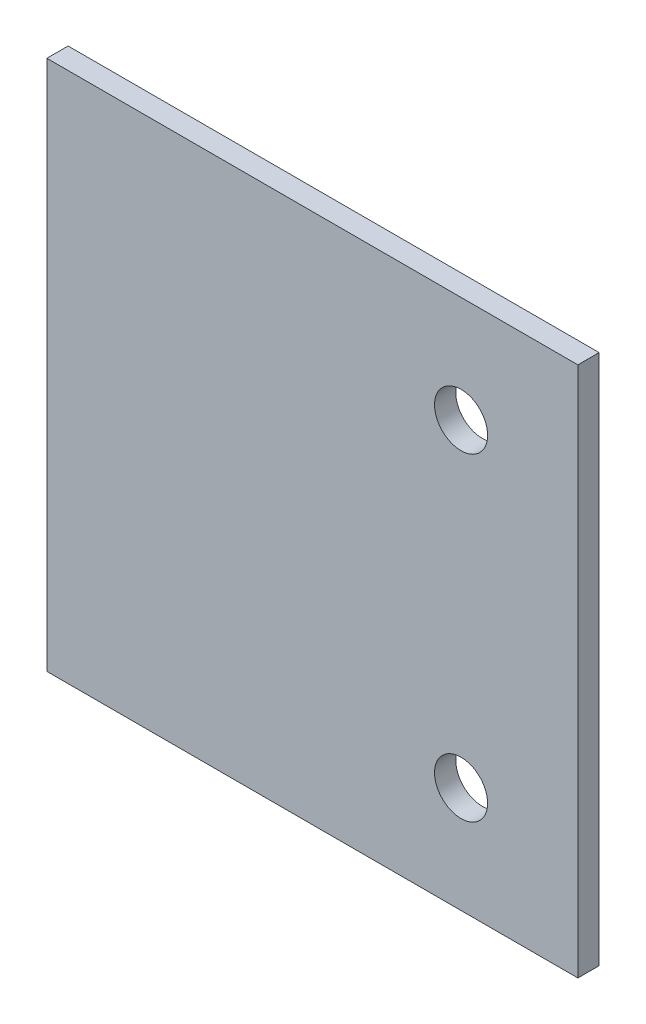
ISO-10303-21;
HEADER;
FILE_DESCRIPTION(('STEP AP214'),'2;1');
FILE_NAME('part.step','',(''),(''),'','','');
FILE_SCHEMA(('AUTOMOTIVE_DESIGN { 1 0 10303 214 1 1 1 1 }'));
ENDSEC;
DATA;
#1=APPLICATION_CONTEXT('core data for automotive mechanical design processes');
#2=APPLICATION_PROTOCOL_DEFINITION('international standard','automotive_design',2000,#1);
#3=PRODUCT_CONTEXT('',#1,'mechanical');
#4=PRODUCT('Part','Part','',(#3));
#5=PRODUCT_RELATED_PRODUCT_CATEGORY('part','',(#4));
#6=PRODUCT_DEFINITION_FORMATION('','',#4);
#7=PRODUCT_DEFINITION_CONTEXT('part definition',#1,'design');
#8=PRODUCT_DEFINITION('design','',#6,#7);
#9=PRODUCT_DEFINITION_SHAPE('','',#8);
#10=(LENGTH_UNIT() NAMED_UNIT(*) SI_UNIT(.MILLI.,.METRE.));
#11=(NAMED_UNIT(*) PLANE_ANGLE_UNIT() SI_UNIT($,.RADIAN.));
#12=(NAMED_UNIT(*) SI_UNIT($,.STERADIAN.) SOLID_ANGLE_UNIT());
#13=UNCERTAINTY_MEASURE_WITH_UNIT(LENGTH_MEASURE(1.E-05),#10,'distance_accuracy_value','');
#14=(GEOMETRIC_REPRESENTATION_CONTEXT(3) GLOBAL_UNCERTAINTY_ASSIGNED_CONTEXT((#13)) GLOBAL_UNIT_ASSIGNED_CONTEXT((#10,
#11,#12)) REPRESENTATION_CONTEXT('',''));
#15=CARTESIAN_POINT('',(0.,0.,0.));
#16=DIRECTION('',(0.,0.,1.));
#17=DIRECTION('',(1.,0.,0.));
#18=AXIS2_PLACEMENT_3D('',#15,#16,#17);
#19=CARTESIAN_POINT('',(25.,-25.,2.));
#20=DIRECTION('',(-1.,0.,0.));
#21=DIRECTION('',(0.,0.,1.));
#22=AXIS2_PLACEMENT_3D('',#19,#20,#21);
#23=PLANE('',#22);
#24=DIRECTION('',(0.,1.,0.));
#25=VECTOR('',#24,1.);
#26=CARTESIAN_POINT('',(25.,-25.,0.));
#27=LINE('',#26,#25);
#28=CARTESIAN_POINT('',(25.,-25.,0.));
#29=VERTEX_POINT('',#28);
#30=CARTESIAN_POINT('',(25.,25.,0.));
#31=VERTEX_POINT('',#30);
#32=EDGE_CURVE('E113',#29,#31,#27,.T.);
#33=ORIENTED_EDGE('',*,*,#32,.T.);
#34=DIRECTION('',(0.,0.,-1.));
#35=VECTOR('',#34,1.);
#36=CARTESIAN_POINT('',(25.,25.,2.));
#37=LINE('',#36,#35);
#38=CARTESIAN_POINT('',(25.,25.,2.));
#39=VERTEX_POINT('',#38);
#40=EDGE_CURVE('E11',#39,#31,#37,.T.);
#41=ORIENTED_EDGE('',*,*,#40,.F.);
#42=DIRECTION('',(0.,1.,0.));
#43=VECTOR('',#42,1.);
#44=CARTESIAN_POINT('',(25.,-25.,2.));
#45=LINE('',#44,#43);
#46=CARTESIAN_POINT('',(25.,-25.,2.));
#47=VERTEX_POINT('',#46);
#48=EDGE_CURVE('E97',#47,#39,#45,.T.);
#49=ORIENTED_EDGE('',*,*,#48,.F.);
#50=DIRECTION('',(0.,0.,-1.));
#51=VECTOR('',#50,1.);
#52=CARTESIAN_POINT('',(25.,-25.,2.));
#53=LINE('',#52,#51);
#54=EDGE_CURVE('E109',#47,#29,#53,.T.);
#55=ORIENTED_EDGE('',*,*,#54,.T.);
#56=EDGE_LOOP('',(#33,#41,#49,#55));
#57=FACE_BOUND('',#56,.T.);
#58=ADVANCED_FACE('F45',(#57),#23,.F.);
#59=CARTESIAN_POINT('',(-25.,25.,2.));
#60=DIRECTION('',(0.,-1.,0.));
#61=DIRECTION('',(0.,0.,-1.));
#62=AXIS2_PLACEMENT_3D('',#59,#60,#61);
#63=PLANE('',#62);
#64=DIRECTION('',(-1.,0.,0.));
#65=VECTOR('',#64,1.);
#66=CARTESIAN_POINT('',(-25.,25.,0.));
#67=LINE('',#66,#65);
#68=CARTESIAN_POINT('',(-25.,25.,0.));
#69=VERTEX_POINT('',#68);
#70=EDGE_CURVE('E102',#31,#69,#67,.T.);
#71=ORIENTED_EDGE('',*,*,#70,.T.);
#72=DIRECTION('',(0.,0.,-1.));
#73=VECTOR('',#72,1.);
#74=CARTESIAN_POINT('',(-25.,25.,2.));
#75=LINE('',#74,#73);
#76=CARTESIAN_POINT('',(-25.,25.,2.));
#77=VERTEX_POINT('',#76);
#78=EDGE_CURVE('E54',#77,#69,#75,.T.);
#79=ORIENTED_EDGE('',*,*,#78,.F.);
#80=DIRECTION('',(-1.,0.,0.));
#81=VECTOR('',#80,1.);
#82=CARTESIAN_POINT('',(-25.,25.,2.));
#83=LINE('',#82,#81);
#84=EDGE_CURVE('E92',#39,#77,#83,.T.);
#85=ORIENTED_EDGE('',*,*,#84,.F.);
#86=ORIENTED_EDGE('',*,*,#40,.T.);
#87=EDGE_LOOP('',(#71,#79,#85,#86));
#88=FACE_BOUND('',#87,.T.);
#89=ADVANCED_FACE('F101',(#88),#63,.F.);
#90=CARTESIAN_POINT('',(-25.,-25.,2.));
#91=DIRECTION('',(1.,0.,0.));
#92=DIRECTION('',(0.,0.,-1.));
#93=AXIS2_PLACEMENT_3D('',#90,#91,#92);
#94=PLANE('',#93);
#95=DIRECTION('',(0.,-1.,0.));
#96=VECTOR('',#95,1.);
#97=CARTESIAN_POINT('',(-25.,-25.,0.));
#98=LINE('',#97,#96);
#99=CARTESIAN_POINT('',(-25.,-25.,0.));
#100=VERTEX_POINT('',#99);
#101=EDGE_CURVE('E79',#69,#100,#98,.T.);
#102=ORIENTED_EDGE('',*,*,#101,.T.);
#103=DIRECTION('',(0.,0.,-1.));
#104=VECTOR('',#103,1.);
#105=CARTESIAN_POINT('',(-25.,-25.,2.));
#106=LINE('',#105,#104);
#107=CARTESIAN_POINT('',(-25.,-25.,2.));
#108=VERTEX_POINT('',#107);
#109=EDGE_CURVE('E104',#108,#100,#106,.T.);
#110=ORIENTED_EDGE('',*,*,#109,.F.);
#111=DIRECTION('',(0.,-1.,0.));
#112=VECTOR('',#111,1.);
#113=CARTESIAN_POINT('',(-25.,-25.,2.));
#114=LINE('',#113,#112);
#115=EDGE_CURVE('E95',#77,#108,#114,.T.);
#116=ORIENTED_EDGE('',*,*,#115,.F.);
#117=ORIENTED_EDGE('',*,*,#78,.T.);
#118=EDGE_LOOP('',(#102,#110,#116,#117));
#119=FACE_BOUND('',#118,.T.);
#120=ADVANCED_FACE('F105',(#119),#94,.F.);
#121=CARTESIAN_POINT('',(-25.,-25.,2.));
#122=DIRECTION('',(0.,1.,0.));
#123=DIRECTION('',(0.,0.,1.));
#124=AXIS2_PLACEMENT_3D('',#121,#122,#123);
#125=PLANE('',#124);
#126=DIRECTION('',(1.,0.,0.));
#127=VECTOR('',#126,1.);
#128=CARTESIAN_POINT('',(-25.,-25.,0.));
#129=LINE('',#128,#127);
#130=EDGE_CURVE('E85',#100,#29,#129,.T.);
#131=ORIENTED_EDGE('',*,*,#130,.T.);
#132=ORIENTED_EDGE('',*,*,#54,.F.);
#133=DIRECTION('',(1.,0.,0.));
#134=VECTOR('',#133,1.);
#135=CARTESIAN_POINT('',(-25.,-25.,2.));
#136=LINE('',#135,#134);
#137=EDGE_CURVE('E62',#108,#47,#136,.T.);
#138=ORIENTED_EDGE('',*,*,#137,.F.);
#139=ORIENTED_EDGE('',*,*,#109,.T.);
#140=EDGE_LOOP('',(#131,#132,#138,#139));
#141=FACE_BOUND('',#140,.T.);
#142=ADVANCED_FACE('F127',(#141),#125,.F.);
#143=CARTESIAN_POINT('',(0.,0.,2.));
#144=DIRECTION('',(0.,0.,-1.));
#145=DIRECTION('',(-1.,0.,0.));
#146=AXIS2_PLACEMENT_3D('',#143,#144,#145);
#147=PLANE('',#146);
#148=CARTESIAN_POINT('',(14.,-15.,2.));
#149=DIRECTION('',(0.,0.,1.));
#150=DIRECTION('',(1.,0.,0.));
#151=AXIS2_PLACEMENT_3D('',#148,#149,#150);
#152=CIRCLE('',#151,2.5);
#153=CARTESIAN_POINT('',(16.5,-15.,2.));
#154=VERTEX_POINT('',#153);
#155=EDGE_CURVE('E138',#154,#154,#152,.T.);
#156=ORIENTED_EDGE('',*,*,#155,.F.);
#157=EDGE_LOOP('',(#156));
#158=FACE_BOUND('',#157,.T.);
#159=CARTESIAN_POINT('',(14.,15.,2.));
#160=DIRECTION('',(0.,0.,1.));
#161=DIRECTION('',(1.,0.,0.));
#162=AXIS2_PLACEMENT_3D('',#159,#160,#161);
#163=CIRCLE('',#162,2.5);
#164=CARTESIAN_POINT('',(16.5,15.,2.));
#165=VERTEX_POINT('',#164);
#166=EDGE_CURVE('E134',#165,#165,#163,.T.);
#167=ORIENTED_EDGE('',*,*,#166,.F.);
#168=EDGE_LOOP('',(#167));
#169=FACE_BOUND('',#168,.T.);
#170=ORIENTED_EDGE('',*,*,#48,.T.);
#171=ORIENTED_EDGE('',*,*,#84,.T.);
#172=ORIENTED_EDGE('',*,*,#115,.T.);
#173=ORIENTED_EDGE('',*,*,#137,.T.);
#174=EDGE_LOOP('',(#170,#171,#172,#173));
#175=FACE_BOUND('',#174,.T.);
#176=ADVANCED_FACE('F93',(#158,#169,#175),#147,.F.);
#177=CARTESIAN_POINT('',(0.,0.,0.));
#178=DIRECTION('',(0.,0.,-1.));
#179=DIRECTION('',(-1.,0.,0.));
#180=AXIS2_PLACEMENT_3D('',#177,#178,#179);
#181=PLANE('',#180);
#182=CARTESIAN_POINT('',(14.,-15.,0.));
#183=DIRECTION('',(0.,0.,-1.));
#184=DIRECTION('',(-1.,0.,0.));
#185=AXIS2_PLACEMENT_3D('',#182,#183,#184);
#186=CIRCLE('',#185,2.5);
#187=CARTESIAN_POINT('',(11.5,-15.,0.));
#188=VERTEX_POINT('',#187);
#189=EDGE_CURVE('E117',#188,#188,#186,.F.);
#190=ORIENTED_EDGE('',*,*,#189,.T.);
#191=EDGE_LOOP('',(#190));
#192=FACE_BOUND('',#191,.T.);
#193=CARTESIAN_POINT('',(14.,15.,0.));
#194=DIRECTION('',(0.,0.,-1.));
#195=DIRECTION('',(-1.,0.,0.));
#196=AXIS2_PLACEMENT_3D('',#193,#194,#195);
#197=CIRCLE('',#196,2.5);
#198=CARTESIAN_POINT('',(11.5,15.,0.));
#199=VERTEX_POINT('',#198);
#200=EDGE_CURVE('E139',#199,#199,#197,.F.);
#201=ORIENTED_EDGE('',*,*,#200,.T.);
#202=EDGE_LOOP('',(#201));
#203=FACE_BOUND('',#202,.T.);
#204=ORIENTED_EDGE('',*,*,#32,.F.);
#205=ORIENTED_EDGE('',*,*,#130,.F.);
#206=ORIENTED_EDGE('',*,*,#101,.F.);
#207=ORIENTED_EDGE('',*,*,#70,.F.);
#208=EDGE_LOOP('',(#204,#205,#206,#207));
#209=FACE_BOUND('',#208,.T.);
#210=ADVANCED_FACE('F130',(#192,#203,#209),#181,.T.);
#211=CARTESIAN_POINT('',(14.,15.,-7.07106781186549));
#212=DIRECTION('',(0.,0.,1.));
#213=DIRECTION('',(1.,0.,0.));
#214=AXIS2_PLACEMENT_3D('',#211,#212,#213);
#215=CYLINDRICAL_SURFACE('',#214,2.5);
#216=ORIENTED_EDGE('',*,*,#166,.T.);
#217=EDGE_LOOP('',(#216));
#218=FACE_BOUND('',#217,.T.);
#219=ORIENTED_EDGE('',*,*,#200,.F.);
#220=EDGE_LOOP('',(#219));
#221=FACE_BOUND('',#220,.T.);
#222=ADVANCED_FACE('F158',(#218,#221),#215,.F.);
#223=CARTESIAN_POINT('',(14.,-15.,-7.07106781186549));
#224=DIRECTION('',(0.,0.,1.));
#225=DIRECTION('',(1.,0.,0.));
#226=AXIS2_PLACEMENT_3D('',#223,#224,#225);
#227=CYLINDRICAL_SURFACE('',#226,2.5);
#228=ORIENTED_EDGE('',*,*,#155,.T.);
#229=EDGE_LOOP('',(#228));
#230=FACE_BOUND('',#229,.T.);
#231=ORIENTED_EDGE('',*,*,#189,.F.);
#232=EDGE_LOOP('',(#231));
#233=FACE_BOUND('',#232,.T.);
#234=ADVANCED_FACE('F150',(#230,#233),#227,.F.);
#235=CLOSED_SHELL('',(#58,#89,#120,#142,#176,#210,#222,#234));
#236=MANIFOLD_SOLID_BREP('B2',#235);
#237=ADVANCED_BREP_SHAPE_REPRESENTATION('',(#18,#236),#14);
#238=SHAPE_DEFINITION_REPRESENTATION(#9,#237);
ENDSEC;
END-ISO-10303-21;
